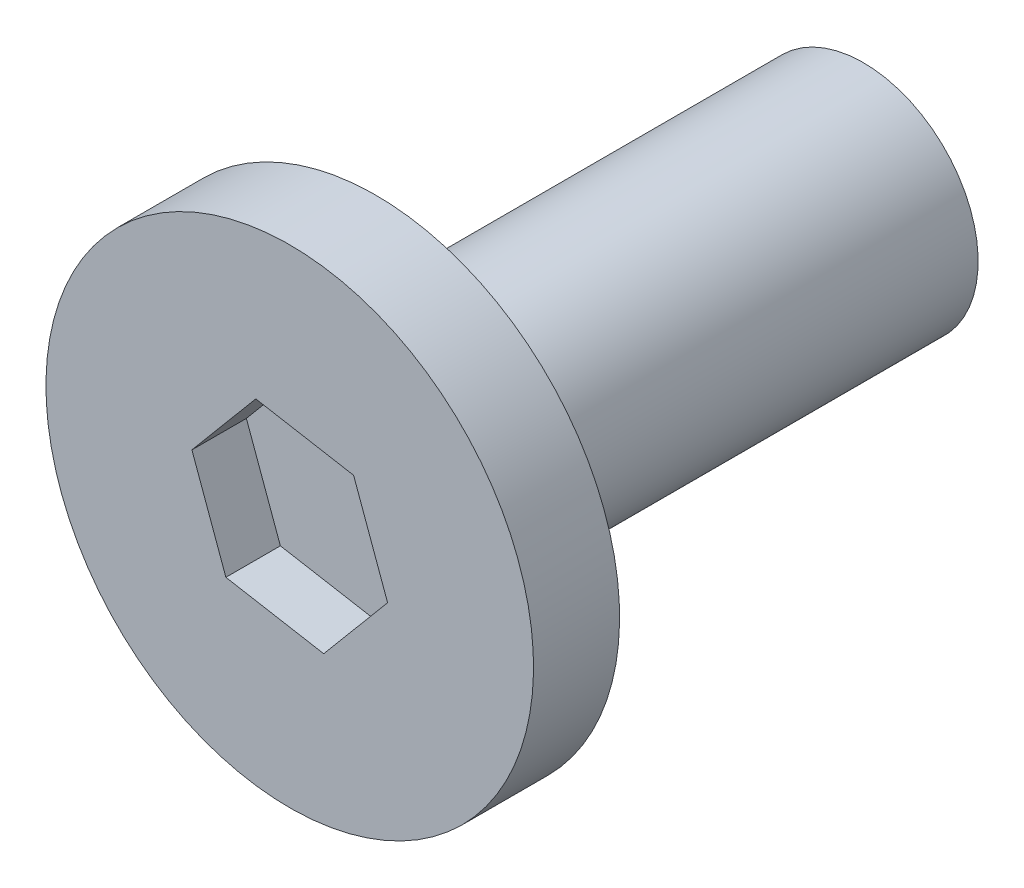
ISO-10303-21;
HEADER;
FILE_DESCRIPTION(('STEP AP214'),'2;1');
FILE_NAME('part.step','',(''),(''),'','','');
FILE_SCHEMA(('AUTOMOTIVE_DESIGN { 1 0 10303 214 1 1 1 1 }'));
ENDSEC;
DATA;
#1=APPLICATION_CONTEXT('core data for automotive mechanical design processes');
#2=APPLICATION_PROTOCOL_DEFINITION('international standard','automotive_design',2000,#1);
#3=PRODUCT_CONTEXT('',#1,'mechanical');
#4=PRODUCT('Part','Part','',(#3));
#5=PRODUCT_RELATED_PRODUCT_CATEGORY('part','',(#4));
#6=PRODUCT_DEFINITION_FORMATION('','',#4);
#7=PRODUCT_DEFINITION_CONTEXT('part definition',#1,'design');
#8=PRODUCT_DEFINITION('design','',#6,#7);
#9=PRODUCT_DEFINITION_SHAPE('','',#8);
#10=(LENGTH_UNIT() NAMED_UNIT(*) SI_UNIT(.MILLI.,.METRE.));
#11=(NAMED_UNIT(*) PLANE_ANGLE_UNIT() SI_UNIT($,.RADIAN.));
#12=(NAMED_UNIT(*) SI_UNIT($,.STERADIAN.) SOLID_ANGLE_UNIT());
#13=UNCERTAINTY_MEASURE_WITH_UNIT(LENGTH_MEASURE(1.E-05),#10,'distance_accuracy_value','');
#14=(GEOMETRIC_REPRESENTATION_CONTEXT(3) GLOBAL_UNCERTAINTY_ASSIGNED_CONTEXT((#13)) GLOBAL_UNIT_ASSIGNED_CONTEXT((#10,
#11,#12)) REPRESENTATION_CONTEXT('',''));
#15=CARTESIAN_POINT('',(0.,0.,0.));
#16=DIRECTION('',(0.,0.,1.));
#17=DIRECTION('',(1.,0.,0.));
#18=AXIS2_PLACEMENT_3D('',#15,#16,#17);
#19=CARTESIAN_POINT('',(69.9596903297769,144.74572943156,364.624757541019));
#20=DIRECTION('',(0.,0.,1.));
#21=DIRECTION('',(1.,0.,0.));
#22=AXIS2_PLACEMENT_3D('',#19,#20,#21);
#23=PLANE('',#22);
#24=CARTESIAN_POINT('',(69.9596903297769,144.74572943156,364.624757541019));
#25=DIRECTION('',(0.,0.,1.));
#26=DIRECTION('',(-0.984807753012209,0.173648177666926,0.));
#27=AXIS2_PLACEMENT_3D('',#24,#25,#26);
#28=CIRCLE('',#27,1.5);
#29=CARTESIAN_POINT('',(68.4824787002586,145.006201698061,364.624757541019));
#30=VERTEX_POINT('',#29);
#31=EDGE_CURVE('E11',#30,#30,#28,.T.);
#32=ORIENTED_EDGE('',*,*,#31,.F.);
#33=EDGE_LOOP('',(#32));
#34=FACE_BOUND('',#33,.T.);
#35=ADVANCED_FACE('F43',(#34),#23,.F.);
#36=CARTESIAN_POINT('',(69.9596903297769,144.74572943156,356.424757541018));
#37=DIRECTION('',(0.,0.,1.));
#38=DIRECTION('',(0.173648177666936,0.984807753012207,0.));
#39=AXIS2_PLACEMENT_3D('',#36,#37,#38);
#40=CYLINDRICAL_SURFACE('',#39,1.5);
#41=ORIENTED_EDGE('',*,*,#31,.T.);
#42=EDGE_LOOP('',(#41));
#43=FACE_BOUND('',#42,.T.);
#44=CARTESIAN_POINT('',(69.9596903297769,144.74572943156,356.124757541019));
#45=DIRECTION('',(0.,0.,1.));
#46=DIRECTION('',(0.984807753012209,-0.173648177666926,0.));
#47=AXIS2_PLACEMENT_3D('',#44,#45,#46);
#48=CIRCLE('',#47,1.5);
#49=CARTESIAN_POINT('',(71.4369019592952,144.48525716506,356.124757541019));
#50=VERTEX_POINT('',#49);
#51=EDGE_CURVE('E53',#50,#50,#48,.T.);
#52=ORIENTED_EDGE('',*,*,#51,.F.);
#53=EDGE_LOOP('',(#52));
#54=FACE_BOUND('',#53,.T.);
#55=ADVANCED_FACE('F190',(#43,#54),#40,.F.);
#56=CARTESIAN_POINT('',(69.9596903297769,144.74572943156,356.124757541019));
#57=DIRECTION('',(0.,0.,-1.));
#58=DIRECTION('',(0.,-1.,0.));
#59=AXIS2_PLACEMENT_3D('',#56,#57,#58);
#60=PLANE('',#59);
#61=CARTESIAN_POINT('',(69.9596903297769,144.74572943156,356.124757541019));
#62=DIRECTION('',(0.,0.,1.));
#63=DIRECTION('',(0.984807753012207,-0.173648177666936,0.));
#64=AXIS2_PLACEMENT_3D('',#61,#62,#63);
#65=CIRCLE('',#64,2.);
#66=CARTESIAN_POINT('',(71.9293058358013,144.398433076227,356.124757541019));
#67=VERTEX_POINT('',#66);
#68=EDGE_CURVE('E92',#67,#67,#65,.T.);
#69=ORIENTED_EDGE('',*,*,#68,.F.);
#70=EDGE_LOOP('',(#69));
#71=FACE_BOUND('',#70,.T.);
#72=ORIENTED_EDGE('',*,*,#51,.T.);
#73=EDGE_LOOP('',(#72));
#74=FACE_BOUND('',#73,.T.);
#75=ADVANCED_FACE('F196',(#71,#74),#60,.T.);
#76=CARTESIAN_POINT('',(30.5073865712524,50.5729322545355,365.174757541019));
#77=DIRECTION('',(0.,0.,1.));
#78=DIRECTION('',(1.,0.,0.));
#79=AXIS2_PLACEMENT_3D('',#76,#77,#78);
#80=PLANE('',#79);
#81=DIRECTION('',(-0.342020143325667,0.939692620785909,0.));
#82=VECTOR('',#81,1.);
#83=CARTESIAN_POINT('',(94.2016621480235,73.755752657629,365.174757541019));
#84=LINE('',#83,#82);
#85=CARTESIAN_POINT('',(68.8463495313244,143.418901535223,365.174757541019));
#86=VERTEX_POINT('',#85);
#87=CARTESIAN_POINT('',(68.2539532658724,145.046496897921,365.174757541019));
#88=VERTEX_POINT('',#87);
#89=EDGE_CURVE('E153',#86,#88,#84,.T.);
#90=ORIENTED_EDGE('',*,*,#89,.F.);
#91=DIRECTION('',(-0.984807753012208,0.173648177666931,0.));
#92=VECTOR('',#91,1.);
#93=CARTESIAN_POINT('',(47.5410436205022,147.175601799548,365.174757541019));
#94=LINE('',#93,#92);
#95=CARTESIAN_POINT('',(70.5520865952293,143.118134068862,365.174757541019));
#96=VERTEX_POINT('',#95);
#97=EDGE_CURVE('E124',#96,#86,#94,.T.);
#98=ORIENTED_EDGE('',*,*,#97,.F.);
#99=DIRECTION('',(-0.64278760968654,-0.766044443118978,0.));
#100=VECTOR('',#99,1.);
#101=CARTESIAN_POINT('',(8.43696505001807,69.0922148129305,365.174757541019));
#102=LINE('',#101,#100);
#103=CARTESIAN_POINT('',(71.6654273936822,144.4449619652,365.174757541019));
#104=VERTEX_POINT('',#103);
#105=EDGE_CURVE('E121',#104,#96,#102,.T.);
#106=ORIENTED_EDGE('',*,*,#105,.F.);
#107=DIRECTION('',(0.342020143325666,-0.939692620785909,0.));
#108=VECTOR('',#107,1.);
#109=CARTESIAN_POINT('',(97.0207400103811,74.7818130876055,365.174757541019));
#110=LINE('',#109,#108);
#111=CARTESIAN_POINT('',(71.0730311282301,146.072557327898,365.174757541019));
#112=VERTEX_POINT('',#111);
#113=EDGE_CURVE('E147',#112,#104,#110,.T.);
#114=ORIENTED_EDGE('',*,*,#113,.F.);
#115=DIRECTION('',(0.984807753012208,-0.173648177666931,0.));
#116=VECTOR('',#115,1.);
#117=CARTESIAN_POINT('',(48.061988153503,150.130025058585,365.174757541019));
#118=LINE('',#117,#116);
#119=CARTESIAN_POINT('',(69.3672940643252,146.373324794259,365.174757541019));
#120=VERTEX_POINT('',#119);
#121=EDGE_CURVE('E233',#120,#112,#118,.T.);
#122=ORIENTED_EDGE('',*,*,#121,.F.);
#123=DIRECTION('',(0.64278760968654,0.766044443118977,0.));
#124=VECTOR('',#123,1.);
#125=CARTESIAN_POINT('',(6.13883172066102,71.02057764199,365.174757541019));
#126=LINE('',#125,#124);
#127=EDGE_CURVE('E156',#88,#120,#126,.T.);
#128=ORIENTED_EDGE('',*,*,#127,.F.);
#129=EDGE_LOOP('',(#90,#98,#106,#114,#122,#128));
#130=FACE_BOUND('',#129,.T.);
#131=ADVANCED_FACE('F201',(#130),#80,.T.);
#132=CARTESIAN_POINT('',(69.2745156644542,146.262755802898,365.424757541018));
#133=DIRECTION('',(-0.766044443118977,0.64278760968654,0.));
#134=DIRECTION('',(0.,0.,1.));
#135=AXIS2_PLACEMENT_3D('',#132,#133,#134);
#136=PLANE('',#135);
#137=DIRECTION('',(-0.642787609686541,-0.766044443118977,0.));
#138=VECTOR('',#137,1.);
#139=CARTESIAN_POINT('',(69.2745156644542,146.262755802898,366.124757541019));
#140=LINE('',#139,#138);
#141=CARTESIAN_POINT('',(69.3672940643252,146.373324794259,366.124757541019));
#142=VERTEX_POINT('',#141);
#143=CARTESIAN_POINT('',(68.2539532658724,145.046496897921,366.124757541019));
#144=VERTEX_POINT('',#143);
#145=EDGE_CURVE('E150',#142,#144,#140,.T.);
#146=ORIENTED_EDGE('',*,*,#145,.T.);
#147=DIRECTION('',(0.,0.,-1.));
#148=VECTOR('',#147,1.);
#149=CARTESIAN_POINT('',(68.2539532658724,145.046496897921,365.424757541018));
#150=LINE('',#149,#148);
#151=EDGE_CURVE('E125',#144,#88,#150,.T.);
#152=ORIENTED_EDGE('',*,*,#151,.T.);
#153=ORIENTED_EDGE('',*,*,#127,.T.);
#154=DIRECTION('',(0.,0.,-1.));
#155=VECTOR('',#154,1.);
#156=CARTESIAN_POINT('',(69.3672940643252,146.373324794259,365.424757541018));
#157=LINE('',#156,#155);
#158=EDGE_CURVE('E170',#142,#120,#157,.T.);
#159=ORIENTED_EDGE('',*,*,#158,.F.);
#160=EDGE_LOOP('',(#146,#152,#153,#159));
#161=FACE_BOUND('',#160,.T.);
#162=ADVANCED_FACE('F204',(#161),#136,.F.);
#163=CARTESIAN_POINT('',(70.9308863729047,146.097621283428,365.424757541018));
#164=DIRECTION('',(0.173648177666931,0.984807753012208,0.));
#165=DIRECTION('',(0.,0.,-1.));
#166=AXIS2_PLACEMENT_3D('',#163,#164,#165);
#167=PLANE('',#166);
#168=DIRECTION('',(-0.984807753012208,0.173648177666931,0.));
#169=VECTOR('',#168,1.);
#170=CARTESIAN_POINT('',(70.9308863729047,146.097621283428,366.124757541019));
#171=LINE('',#170,#169);
#172=CARTESIAN_POINT('',(71.0730311282301,146.072557327898,366.124757541019));
#173=VERTEX_POINT('',#172);
#174=EDGE_CURVE('E140',#173,#142,#171,.T.);
#175=ORIENTED_EDGE('',*,*,#174,.T.);
#176=ORIENTED_EDGE('',*,*,#158,.T.);
#177=ORIENTED_EDGE('',*,*,#121,.T.);
#178=DIRECTION('',(0.,0.,-1.));
#179=VECTOR('',#178,1.);
#180=CARTESIAN_POINT('',(71.0730311282301,146.072557327898,365.424757541018));
#181=LINE('',#180,#179);
#182=EDGE_CURVE('E144',#173,#112,#181,.T.);
#183=ORIENTED_EDGE('',*,*,#182,.F.);
#184=EDGE_LOOP('',(#175,#176,#177,#183));
#185=FACE_BOUND('',#184,.T.);
#186=ADVANCED_FACE('F209',(#185),#167,.F.);
#187=CARTESIAN_POINT('',(71.6160610382278,144.580594912091,374.624757541018));
#188=DIRECTION('',(0.939692620785909,0.342020143325666,0.));
#189=DIRECTION('',(0.,0.,-1.));
#190=AXIS2_PLACEMENT_3D('',#187,#188,#189);
#191=PLANE('',#190);
#192=DIRECTION('',(-0.342020143325667,0.939692620785909,0.));
#193=VECTOR('',#192,1.);
#194=CARTESIAN_POINT('',(71.6160610382278,144.580594912091,366.124757541019));
#195=LINE('',#194,#193);
#196=CARTESIAN_POINT('',(71.6654273936822,144.4449619652,366.124757541019));
#197=VERTEX_POINT('',#196);
#198=EDGE_CURVE('E138',#197,#173,#195,.T.);
#199=ORIENTED_EDGE('',*,*,#198,.T.);
#200=ORIENTED_EDGE('',*,*,#182,.T.);
#201=ORIENTED_EDGE('',*,*,#113,.T.);
#202=DIRECTION('',(0.,0.,-1.));
#203=VECTOR('',#202,1.);
#204=CARTESIAN_POINT('',(71.6654273936822,144.4449619652,374.624757541018));
#205=LINE('',#204,#203);
#206=EDGE_CURVE('E158',#197,#104,#205,.T.);
#207=ORIENTED_EDGE('',*,*,#206,.F.);
#208=EDGE_LOOP('',(#199,#200,#201,#207));
#209=FACE_BOUND('',#208,.T.);
#210=ADVANCED_FACE('F207',(#209),#191,.F.);
#211=CARTESIAN_POINT('',(70.6448649951004,143.228703060223,374.624757541018));
#212=DIRECTION('',(0.766044443118978,-0.64278760968654,0.));
#213=DIRECTION('',(0.,0.,-1.));
#214=AXIS2_PLACEMENT_3D('',#211,#212,#213);
#215=PLANE('',#214);
#216=DIRECTION('',(0.64278760968654,0.766044443118978,0.));
#217=VECTOR('',#216,1.);
#218=CARTESIAN_POINT('',(70.6448649951004,143.228703060223,366.124757541019));
#219=LINE('',#218,#217);
#220=CARTESIAN_POINT('',(70.5520865952293,143.118134068862,366.124757541019));
#221=VERTEX_POINT('',#220);
#222=EDGE_CURVE('E118',#221,#197,#219,.T.);
#223=ORIENTED_EDGE('',*,*,#222,.T.);
#224=ORIENTED_EDGE('',*,*,#206,.T.);
#225=ORIENTED_EDGE('',*,*,#105,.T.);
#226=DIRECTION('',(0.,0.,-1.));
#227=VECTOR('',#226,1.);
#228=CARTESIAN_POINT('',(70.5520865952293,143.118134068862,365.424757541018));
#229=LINE('',#228,#227);
#230=EDGE_CURVE('E113',#221,#96,#229,.T.);
#231=ORIENTED_EDGE('',*,*,#230,.F.);
#232=EDGE_LOOP('',(#223,#224,#225,#231));
#233=FACE_BOUND('',#232,.T.);
#234=ADVANCED_FACE('F115',(#233),#215,.F.);
#235=CARTESIAN_POINT('',(68.9884942866499,143.393837579692,365.424757541018));
#236=DIRECTION('',(-0.173648177666931,-0.984807753012208,0.));
#237=DIRECTION('',(-0.984807753012208,0.173648177666931,0.));
#238=AXIS2_PLACEMENT_3D('',#235,#236,#237);
#239=PLANE('',#238);
#240=DIRECTION('',(0.984807753012208,-0.173648177666931,0.));
#241=VECTOR('',#240,1.);
#242=CARTESIAN_POINT('',(68.9884942866499,143.393837579692,366.124757541019));
#243=LINE('',#242,#241);
#244=CARTESIAN_POINT('',(68.8463495313244,143.418901535223,366.124757541019));
#245=VERTEX_POINT('',#244);
#246=EDGE_CURVE('E47',#245,#221,#243,.T.);
#247=ORIENTED_EDGE('',*,*,#246,.T.);
#248=ORIENTED_EDGE('',*,*,#230,.T.);
#249=ORIENTED_EDGE('',*,*,#97,.T.);
#250=DIRECTION('',(0.,0.,-1.));
#251=VECTOR('',#250,1.);
#252=CARTESIAN_POINT('',(68.8463495313244,143.418901535223,365.424757541018));
#253=LINE('',#252,#251);
#254=EDGE_CURVE('E130',#245,#86,#253,.T.);
#255=ORIENTED_EDGE('',*,*,#254,.F.);
#256=EDGE_LOOP('',(#247,#248,#249,#255));
#257=FACE_BOUND('',#256,.T.);
#258=ADVANCED_FACE('F128',(#257),#239,.F.);
#259=CARTESIAN_POINT('',(68.3033196213267,144.91086395103,365.424757541018));
#260=DIRECTION('',(-0.939692620785909,-0.342020143325667,0.));
#261=DIRECTION('',(-0.342020143325667,0.939692620785909,0.));
#262=AXIS2_PLACEMENT_3D('',#259,#260,#261);
#263=PLANE('',#262);
#264=DIRECTION('',(0.342020143325667,-0.939692620785909,0.));
#265=VECTOR('',#264,1.);
#266=CARTESIAN_POINT('',(68.3033196213267,144.91086395103,366.124757541019));
#267=LINE('',#266,#265);
#268=EDGE_CURVE('E148',#144,#245,#267,.T.);
#269=ORIENTED_EDGE('',*,*,#268,.T.);
#270=ORIENTED_EDGE('',*,*,#254,.T.);
#271=ORIENTED_EDGE('',*,*,#89,.T.);
#272=ORIENTED_EDGE('',*,*,#151,.F.);
#273=EDGE_LOOP('',(#269,#270,#271,#272));
#274=FACE_BOUND('',#273,.T.);
#275=ADVANCED_FACE('F45',(#274),#263,.F.);
#276=CARTESIAN_POINT('',(69.9596903297769,144.74572943156,366.124757541019));
#277=DIRECTION('',(0.,0.,1.));
#278=DIRECTION('',(1.,0.,0.));
#279=AXIS2_PLACEMENT_3D('',#276,#277,#278);
#280=PLANE('',#279);
#281=ORIENTED_EDGE('',*,*,#268,.F.);
#282=ORIENTED_EDGE('',*,*,#145,.F.);
#283=ORIENTED_EDGE('',*,*,#174,.F.);
#284=ORIENTED_EDGE('',*,*,#198,.F.);
#285=ORIENTED_EDGE('',*,*,#222,.F.);
#286=ORIENTED_EDGE('',*,*,#246,.F.);
#287=EDGE_LOOP('',(#281,#282,#283,#284,#285,#286));
#288=FACE_BOUND('',#287,.T.);
#289=CARTESIAN_POINT('',(69.9596903297769,144.74572943156,366.124757541019));
#290=DIRECTION('',(0.,0.,-1.));
#291=DIRECTION('',(-0.984807753012208,0.17364817766693,0.));
#292=AXIS2_PLACEMENT_3D('',#289,#290,#291);
#293=CIRCLE('',#292,4.25);
#294=CARTESIAN_POINT('',(65.774257379475,145.483734186645,366.124757541019));
#295=VERTEX_POINT('',#294);
#296=EDGE_CURVE('E151',#295,#295,#293,.T.);
#297=ORIENTED_EDGE('',*,*,#296,.F.);
#298=EDGE_LOOP('',(#297));
#299=FACE_BOUND('',#298,.T.);
#300=ADVANCED_FACE('F134',(#288,#299),#280,.T.);
#301=CARTESIAN_POINT('',(69.9596903297769,144.74572943156,364.624757541019));
#302=DIRECTION('',(0.,0.,1.));
#303=DIRECTION('',(1.,0.,0.));
#304=AXIS2_PLACEMENT_3D('',#301,#302,#303);
#305=PLANE('',#304);
#306=CARTESIAN_POINT('',(69.9596903297769,144.74572943156,364.624757541019));
#307=DIRECTION('',(0.,0.,-1.));
#308=DIRECTION('',(-0.984807753012208,0.17364817766693,0.));
#309=AXIS2_PLACEMENT_3D('',#306,#307,#308);
#310=CIRCLE('',#309,4.25);
#311=CARTESIAN_POINT('',(65.774257379475,145.483734186645,364.624757541019));
#312=VERTEX_POINT('',#311);
#313=EDGE_CURVE('E160',#312,#312,#310,.T.);
#314=ORIENTED_EDGE('',*,*,#313,.T.);
#315=EDGE_LOOP('',(#314));
#316=FACE_BOUND('',#315,.T.);
#317=CARTESIAN_POINT('',(69.9596903297769,144.74572943156,364.624757541019));
#318=DIRECTION('',(0.,0.,-1.));
#319=DIRECTION('',(-0.984807753012207,0.173648177666936,0.));
#320=AXIS2_PLACEMENT_3D('',#317,#318,#319);
#321=CIRCLE('',#320,2.);
#322=CARTESIAN_POINT('',(67.9900748237525,145.093025786894,364.624757541019));
#323=VERTEX_POINT('',#322);
#324=EDGE_CURVE('E87',#323,#323,#321,.T.);
#325=ORIENTED_EDGE('',*,*,#324,.F.);
#326=EDGE_LOOP('',(#325));
#327=FACE_BOUND('',#326,.T.);
#328=ADVANCED_FACE('F173',(#316,#327),#305,.F.);
#329=CARTESIAN_POINT('',(69.9596903297769,144.74572943156,390.424757541018));
#330=DIRECTION('',(0.,0.,-1.));
#331=DIRECTION('',(0.17364817766693,0.984807753012208,0.));
#332=AXIS2_PLACEMENT_3D('',#329,#330,#331);
#333=CYLINDRICAL_SURFACE('',#332,4.25);
#334=ORIENTED_EDGE('',*,*,#296,.T.);
#335=EDGE_LOOP('',(#334));
#336=FACE_BOUND('',#335,.T.);
#337=ORIENTED_EDGE('',*,*,#313,.F.);
#338=EDGE_LOOP('',(#337));
#339=FACE_BOUND('',#338,.T.);
#340=ADVANCED_FACE('F176',(#336,#339),#333,.T.);
#341=CARTESIAN_POINT('',(69.9596903297769,144.74572943156,375.624757541018));
#342=DIRECTION('',(0.,0.,-1.));
#343=DIRECTION('',(-0.173648177666928,-0.984807753012209,0.));
#344=AXIS2_PLACEMENT_3D('',#341,#342,#343);
#345=CYLINDRICAL_SURFACE('',#344,2.);
#346=ORIENTED_EDGE('',*,*,#68,.T.);
#347=EDGE_LOOP('',(#346));
#348=FACE_BOUND('',#347,.T.);
#349=ORIENTED_EDGE('',*,*,#324,.T.);
#350=EDGE_LOOP('',(#349));
#351=FACE_BOUND('',#350,.T.);
#352=ADVANCED_FACE('F178',(#348,#351),#345,.T.);
#353=CLOSED_SHELL('',(#35,#55,#75,#131,#162,#186,#210,#234,#258,#275,#300,#328,#340,#352));
#354=MANIFOLD_SOLID_BREP('B2',#353);
#355=ADVANCED_BREP_SHAPE_REPRESENTATION('',(#18,#354),#14);
#356=SHAPE_DEFINITION_REPRESENTATION(#9,#355);
ENDSEC;
END-ISO-10303-21;
